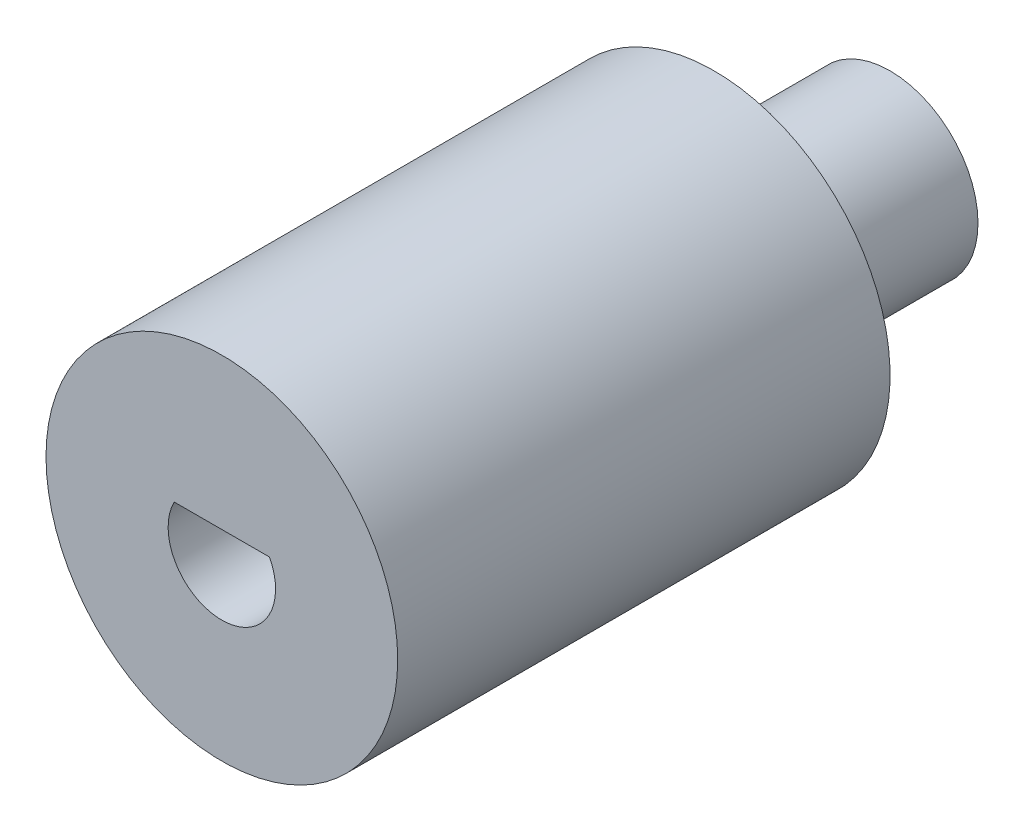
ISO-10303-21;
HEADER;
FILE_DESCRIPTION(('STEP AP214'),'2;1');
FILE_NAME('part.step','',(''),(''),'','','');
FILE_SCHEMA(('AUTOMOTIVE_DESIGN { 1 0 10303 214 1 1 1 1 }'));
ENDSEC;
DATA;
#1=APPLICATION_CONTEXT('core data for automotive mechanical design processes');
#2=APPLICATION_PROTOCOL_DEFINITION('international standard','automotive_design',2000,#1);
#3=PRODUCT_CONTEXT('',#1,'mechanical');
#4=PRODUCT('Part','Part','',(#3));
#5=PRODUCT_RELATED_PRODUCT_CATEGORY('part','',(#4));
#6=PRODUCT_DEFINITION_FORMATION('','',#4);
#7=PRODUCT_DEFINITION_CONTEXT('part definition',#1,'design');
#8=PRODUCT_DEFINITION('design','',#6,#7);
#9=PRODUCT_DEFINITION_SHAPE('','',#8);
#10=(LENGTH_UNIT() NAMED_UNIT(*) SI_UNIT(.MILLI.,.METRE.));
#11=(NAMED_UNIT(*) PLANE_ANGLE_UNIT() SI_UNIT($,.RADIAN.));
#12=(NAMED_UNIT(*) SI_UNIT($,.STERADIAN.) SOLID_ANGLE_UNIT());
#13=UNCERTAINTY_MEASURE_WITH_UNIT(LENGTH_MEASURE(1.E-05),#10,'distance_accuracy_value','');
#14=(GEOMETRIC_REPRESENTATION_CONTEXT(3) GLOBAL_UNCERTAINTY_ASSIGNED_CONTEXT((#13)) GLOBAL_UNIT_ASSIGNED_CONTEXT((#10,
#11,#12)) REPRESENTATION_CONTEXT('',''));
#15=CARTESIAN_POINT('',(0.,0.,0.));
#16=DIRECTION('',(0.,0.,1.));
#17=DIRECTION('',(1.,0.,0.));
#18=AXIS2_PLACEMENT_3D('',#15,#16,#17);
#19=CARTESIAN_POINT('',(0.,0.,-12.7));
#20=DIRECTION('',(0.,0.,-1.));
#21=DIRECTION('',(-1.,0.,0.));
#22=AXIS2_PLACEMENT_3D('',#19,#20,#21);
#23=PLANE('',#22);
#24=CARTESIAN_POINT('',(0.,0.,-12.7));
#25=DIRECTION('',(0.,0.,-1.));
#26=DIRECTION('',(-1.,0.,0.));
#27=AXIS2_PLACEMENT_3D('',#24,#25,#26);
#28=CIRCLE('',#27,6.35);
#29=CARTESIAN_POINT('',(-6.35,0.,-12.7));
#30=VERTEX_POINT('',#29);
#31=EDGE_CURVE('E72',#30,#30,#28,.T.);
#32=ORIENTED_EDGE('',*,*,#31,.T.);
#33=EDGE_LOOP('',(#32));
#34=FACE_BOUND('',#33,.T.);
#35=CARTESIAN_POINT('',(0.,0.,-12.7));
#36=DIRECTION('',(0.,0.,-1.));
#37=DIRECTION('',(-1.,0.,0.));
#38=AXIS2_PLACEMENT_3D('',#35,#36,#37);
#39=CIRCLE('',#38,3.175);
#40=CARTESIAN_POINT('',(-3.175,0.,-12.7));
#41=VERTEX_POINT('',#40);
#42=EDGE_CURVE('E83',#41,#41,#39,.T.);
#43=ORIENTED_EDGE('',*,*,#42,.F.);
#44=EDGE_LOOP('',(#43));
#45=FACE_BOUND('',#44,.T.);
#46=ADVANCED_FACE('F36',(#34,#45),#23,.T.);
#47=CARTESIAN_POINT('',(0.,0.,5.08));
#48=DIRECTION('',(0.,0.,1.));
#49=DIRECTION('',(1.,0.,0.));
#50=AXIS2_PLACEMENT_3D('',#47,#48,#49);
#51=PLANE('',#50);
#52=CARTESIAN_POINT('',(0.,0.,5.08));
#53=DIRECTION('',(0.,0.,1.));
#54=DIRECTION('',(1.,0.,0.));
#55=AXIS2_PLACEMENT_3D('',#52,#53,#54);
#56=CIRCLE('',#55,6.35);
#57=CARTESIAN_POINT('',(6.35,0.,5.08));
#58=VERTEX_POINT('',#57);
#59=EDGE_CURVE('E11',#58,#58,#56,.T.);
#60=ORIENTED_EDGE('',*,*,#59,.T.);
#61=EDGE_LOOP('',(#60));
#62=FACE_BOUND('',#61,.T.);
#63=DIRECTION('',(-1.,0.,0.));
#64=VECTOR('',#63,1.);
#65=CARTESIAN_POINT('',(-1.72122780344341,0.89497198204936,5.08));
#66=LINE('',#65,#64);
#67=CARTESIAN_POINT('',(1.72122780344341,0.89497198204936,5.08));
#68=VERTEX_POINT('',#67);
#69=CARTESIAN_POINT('',(-1.72122780344341,0.89497198204936,5.08));
#70=VERTEX_POINT('',#69);
#71=EDGE_CURVE('E56',#68,#70,#66,.T.);
#72=ORIENTED_EDGE('',*,*,#71,.F.);
#73=CARTESIAN_POINT('',(0.,0.,5.08));
#74=DIRECTION('',(0.,0.,1.));
#75=DIRECTION('',(1.,0.,0.));
#76=AXIS2_PLACEMENT_3D('',#73,#74,#75);
#77=CIRCLE('',#76,1.94);
#78=EDGE_CURVE('E75',#70,#68,#77,.T.);
#79=ORIENTED_EDGE('',*,*,#78,.F.);
#80=EDGE_LOOP('',(#72,#79));
#81=FACE_BOUND('',#80,.T.);
#82=ADVANCED_FACE('F98',(#62,#81),#51,.T.);
#83=CARTESIAN_POINT('',(0.,0.,5.08));
#84=DIRECTION('',(0.,0.,-1.));
#85=DIRECTION('',(-1.,0.,0.));
#86=AXIS2_PLACEMENT_3D('',#83,#84,#85);
#87=CYLINDRICAL_SURFACE('',#86,6.35);
#88=ORIENTED_EDGE('',*,*,#59,.F.);
#89=EDGE_LOOP('',(#88));
#90=FACE_BOUND('',#89,.T.);
#91=ORIENTED_EDGE('',*,*,#31,.F.);
#92=EDGE_LOOP('',(#91));
#93=FACE_BOUND('',#92,.T.);
#94=ADVANCED_FACE('F38',(#90,#93),#87,.T.);
#95=CARTESIAN_POINT('',(0.,0.,5.08));
#96=DIRECTION('',(0.,0.,-1.));
#97=DIRECTION('',(-1.,0.,0.));
#98=AXIS2_PLACEMENT_3D('',#95,#96,#97);
#99=CYLINDRICAL_SURFACE('',#98,1.94);
#100=CARTESIAN_POINT('',(0.,0.,0.));
#101=DIRECTION('',(0.,0.,1.));
#102=DIRECTION('',(1.,0.,0.));
#103=AXIS2_PLACEMENT_3D('',#100,#101,#102);
#104=CIRCLE('',#103,1.94);
#105=CARTESIAN_POINT('',(-1.72122780344341,0.89497198204936,0.));
#106=VERTEX_POINT('',#105);
#107=CARTESIAN_POINT('',(1.72122780344341,0.89497198204936,0.));
#108=VERTEX_POINT('',#107);
#109=EDGE_CURVE('E69',#106,#108,#104,.T.);
#110=ORIENTED_EDGE('',*,*,#109,.F.);
#111=DIRECTION('',(0.,0.,-1.));
#112=VECTOR('',#111,1.);
#113=CARTESIAN_POINT('',(-1.72122780344341,0.89497198204936,5.08));
#114=LINE('',#113,#112);
#115=EDGE_CURVE('E60',#70,#106,#114,.T.);
#116=ORIENTED_EDGE('',*,*,#115,.F.);
#117=ORIENTED_EDGE('',*,*,#78,.T.);
#118=DIRECTION('',(0.,0.,-1.));
#119=VECTOR('',#118,1.);
#120=CARTESIAN_POINT('',(1.72122780344341,0.89497198204936,5.08));
#121=LINE('',#120,#119);
#122=EDGE_CURVE('E44',#68,#108,#121,.T.);
#123=ORIENTED_EDGE('',*,*,#122,.T.);
#124=EDGE_LOOP('',(#110,#116,#117,#123));
#125=FACE_BOUND('',#124,.T.);
#126=ADVANCED_FACE('F70',(#125),#99,.F.);
#127=CARTESIAN_POINT('',(-1.72122780344341,0.89497198204936,5.08));
#128=DIRECTION('',(0.,-1.,0.));
#129=DIRECTION('',(0.,0.,-1.));
#130=AXIS2_PLACEMENT_3D('',#127,#128,#129);
#131=PLANE('',#130);
#132=DIRECTION('',(-1.,0.,0.));
#133=VECTOR('',#132,1.);
#134=CARTESIAN_POINT('',(-1.72122780344341,0.89497198204936,0.));
#135=LINE('',#134,#133);
#136=EDGE_CURVE('E64',#108,#106,#135,.T.);
#137=ORIENTED_EDGE('',*,*,#136,.F.);
#138=ORIENTED_EDGE('',*,*,#122,.F.);
#139=ORIENTED_EDGE('',*,*,#71,.T.);
#140=ORIENTED_EDGE('',*,*,#115,.T.);
#141=EDGE_LOOP('',(#137,#138,#139,#140));
#142=FACE_BOUND('',#141,.T.);
#143=ADVANCED_FACE('F62',(#142),#131,.T.);
#144=CARTESIAN_POINT('',(0.,0.,0.));
#145=DIRECTION('',(0.,0.,-1.));
#146=DIRECTION('',(-1.,0.,0.));
#147=AXIS2_PLACEMENT_3D('',#144,#145,#146);
#148=PLANE('',#147);
#149=ORIENTED_EDGE('',*,*,#109,.T.);
#150=ORIENTED_EDGE('',*,*,#136,.T.);
#151=EDGE_LOOP('',(#149,#150));
#152=FACE_BOUND('',#151,.T.);
#153=ADVANCED_FACE('F74',(#152),#148,.F.);
#154=CARTESIAN_POINT('',(0.,0.,-19.05));
#155=DIRECTION('',(0.,0.,1.));
#156=DIRECTION('',(1.,0.,0.));
#157=AXIS2_PLACEMENT_3D('',#154,#155,#156);
#158=CYLINDRICAL_SURFACE('',#157,3.175);
#159=CARTESIAN_POINT('',(0.,0.,-19.05));
#160=DIRECTION('',(0.,0.,-1.));
#161=DIRECTION('',(-1.,0.,0.));
#162=AXIS2_PLACEMENT_3D('',#159,#160,#161);
#163=CIRCLE('',#162,3.175);
#164=CARTESIAN_POINT('',(-3.175,0.,-19.05));
#165=VERTEX_POINT('',#164);
#166=EDGE_CURVE('E82',#165,#165,#163,.T.);
#167=ORIENTED_EDGE('',*,*,#166,.F.);
#168=EDGE_LOOP('',(#167));
#169=FACE_BOUND('',#168,.T.);
#170=ORIENTED_EDGE('',*,*,#42,.T.);
#171=EDGE_LOOP('',(#170));
#172=FACE_BOUND('',#171,.T.);
#173=ADVANCED_FACE('F91',(#169,#172),#158,.T.);
#174=CARTESIAN_POINT('',(0.,0.,-19.05));
#175=DIRECTION('',(0.,0.,-1.));
#176=DIRECTION('',(-1.,0.,0.));
#177=AXIS2_PLACEMENT_3D('',#174,#175,#176);
#178=PLANE('',#177);
#179=ORIENTED_EDGE('',*,*,#166,.T.);
#180=EDGE_LOOP('',(#179));
#181=FACE_BOUND('',#180,.T.);
#182=ADVANCED_FACE('F89',(#181),#178,.T.);
#183=CLOSED_SHELL('',(#46,#82,#94,#126,#143,#153,#173,#182));
#184=MANIFOLD_SOLID_BREP('B2',#183);
#185=ADVANCED_BREP_SHAPE_REPRESENTATION('',(#18,#184),#14);
#186=SHAPE_DEFINITION_REPRESENTATION(#9,#185);
ENDSEC;
END-ISO-10303-21;
